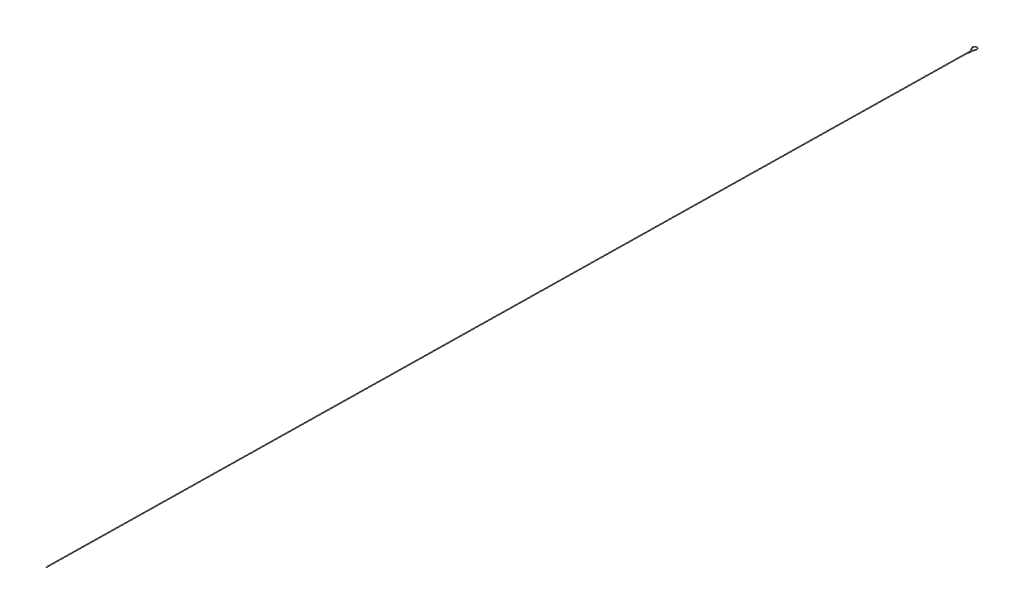
ISO-10303-21;
HEADER;
FILE_DESCRIPTION(('STEP AP214'),'2;1');
FILE_NAME('part.step','',(''),(''),'','','');
FILE_SCHEMA(('AUTOMOTIVE_DESIGN { 1 0 10303 214 1 1 1 1 }'));
ENDSEC;
DATA;
#1=APPLICATION_CONTEXT('core data for automotive mechanical design processes');
#2=APPLICATION_PROTOCOL_DEFINITION('international standard','automotive_design',2000,#1);
#3=PRODUCT_CONTEXT('',#1,'mechanical');
#4=PRODUCT('Part','Part','',(#3));
#5=PRODUCT_RELATED_PRODUCT_CATEGORY('part','',(#4));
#6=PRODUCT_DEFINITION_FORMATION('','',#4);
#7=PRODUCT_DEFINITION_CONTEXT('part definition',#1,'design');
#8=PRODUCT_DEFINITION('design','',#6,#7);
#9=PRODUCT_DEFINITION_SHAPE('','',#8);
#10=(LENGTH_UNIT() NAMED_UNIT(*) SI_UNIT(.MILLI.,.METRE.));
#11=(NAMED_UNIT(*) PLANE_ANGLE_UNIT() SI_UNIT($,.RADIAN.));
#12=(NAMED_UNIT(*) SI_UNIT($,.STERADIAN.) SOLID_ANGLE_UNIT());
#13=UNCERTAINTY_MEASURE_WITH_UNIT(LENGTH_MEASURE(1.E-05),#10,'distance_accuracy_value','');
#14=(GEOMETRIC_REPRESENTATION_CONTEXT(3) GLOBAL_UNCERTAINTY_ASSIGNED_CONTEXT((#13)) GLOBAL_UNIT_ASSIGNED_CONTEXT((#10,
#11,#12)) REPRESENTATION_CONTEXT('',''));
#15=CARTESIAN_POINT('',(0.,0.,0.));
#16=DIRECTION('',(0.,0.,1.));
#17=DIRECTION('',(1.,0.,0.));
#18=AXIS2_PLACEMENT_3D('',#15,#16,#17);
#19=CARTESIAN_POINT('',(3.19999999999998,0.,-4558.79739076363));
#20=DIRECTION('',(0.,0.,-1.));
#21=DIRECTION('',(-1.,0.,0.));
#22=AXIS2_PLACEMENT_3D('',#19,#20,#21);
#23=PLANE('',#22);
#24=CARTESIAN_POINT('',(3.19999999999998,0.,-4558.79739076363));
#25=DIRECTION('',(0.,0.,-1.));
#26=DIRECTION('',(-1.,0.,0.));
#27=AXIS2_PLACEMENT_3D('',#24,#25,#26);
#28=CIRCLE('',#27,1.57499999999999);
#29=CARTESIAN_POINT('',(1.62499999999999,0.,-4558.79739076363));
#30=VERTEX_POINT('',#29);
#31=EDGE_CURVE('E40',#30,#30,#28,.T.);
#32=ORIENTED_EDGE('',*,*,#31,.F.);
#33=EDGE_LOOP('',(#32));
#34=FACE_BOUND('',#33,.T.);
#35=ADVANCED_FACE('F37',(#34),#23,.F.);
#36=CARTESIAN_POINT('',(-76.2,0.,10.));
#37=DIRECTION('',(0.,0.,1.));
#38=DIRECTION('',(1.,0.,0.));
#39=AXIS2_PLACEMENT_3D('',#36,#37,#38);
#40=PLANE('',#39);
#41=CARTESIAN_POINT('',(-76.2,0.,10.));
#42=DIRECTION('',(0.,0.,1.));
#43=DIRECTION('',(1.,0.,0.));
#44=AXIS2_PLACEMENT_3D('',#41,#42,#43);
#45=CIRCLE('',#44,1.57499999999999);
#46=CARTESIAN_POINT('',(-74.625,0.,10.));
#47=VERTEX_POINT('',#46);
#48=EDGE_CURVE('E45',#47,#47,#45,.T.);
#49=ORIENTED_EDGE('',*,*,#48,.T.);
#50=EDGE_LOOP('',(#49));
#51=FACE_BOUND('',#50,.T.);
#52=ADVANCED_FACE('F100',(#51),#40,.T.);
#53=CARTESIAN_POINT('',(3.19999999999998,0.,-4571.14076089777));
#54=DIRECTION('',(0.,0.,1.));
#55=DIRECTION('',(1.,0.,0.));
#56=AXIS2_PLACEMENT_3D('',#53,#54,#55);
#57=CYLINDRICAL_SURFACE('',#56,1.57499999999999);
#58=CARTESIAN_POINT('',(3.2,0.,-4570.94076089777));
#59=DIRECTION('',(-0.0145206306415862,0.,0.999894570085152));
#60=DIRECTION('',(-0.999894570085152,0.,-0.0145206306415862));
#61=AXIS2_PLACEMENT_3D('',#58,#59,#60);
#62=ELLIPSE('',#61,1.57516606962458,1.57499999999999);
#63=CARTESIAN_POINT('',(1.625,0.,-4570.96363330246));
#64=VERTEX_POINT('',#63);
#65=EDGE_CURVE('E63',#64,#64,#62,.T.);
#66=ORIENTED_EDGE('',*,*,#65,.T.);
#67=EDGE_LOOP('',(#66));
#68=FACE_BOUND('',#67,.T.);
#69=ORIENTED_EDGE('',*,*,#31,.T.);
#70=EDGE_LOOP('',(#69));
#71=FACE_BOUND('',#70,.T.);
#72=ADVANCED_FACE('F97',(#68,#71),#57,.T.);
#73=CARTESIAN_POINT('',(0.,0.,-4558.59739076363));
#74=DIRECTION('',(0.,0.,-1.));
#75=DIRECTION('',(-1.,0.,0.));
#76=AXIS2_PLACEMENT_3D('',#73,#74,#75);
#77=CYLINDRICAL_SURFACE('',#76,1.57499999999999);
#78=CARTESIAN_POINT('',(0.,0.,-4558.79739076363));
#79=DIRECTION('',(0.00835659181222621,0.,-0.999965083077046));
#80=DIRECTION('',(0.999965083077046,0.,0.00835659181222621));
#81=AXIS2_PLACEMENT_3D('',#78,#79,#80);
#82=ELLIPSE('',#81,1.57505499607394,1.57499999999999);
#83=CARTESIAN_POINT('',(1.57499999999998,0.,-4558.78422867195));
#84=VERTEX_POINT('',#83);
#85=EDGE_CURVE('E51',#84,#84,#82,.T.);
#86=ORIENTED_EDGE('',*,*,#85,.T.);
#87=EDGE_LOOP('',(#86));
#88=FACE_BOUND('',#87,.T.);
#89=CARTESIAN_POINT('',(0.,0.,-4567.06055415462));
#90=DIRECTION('',(0.,0.,1.));
#91=DIRECTION('',(1.,0.,0.));
#92=AXIS2_PLACEMENT_3D('',#89,#90,#91);
#93=CIRCLE('',#92,1.57499999999999);
#94=CARTESIAN_POINT('',(1.57500000000015,0.,-4567.06055415462));
#95=VERTEX_POINT('',#94);
#96=EDGE_CURVE('E58',#95,#95,#93,.T.);
#97=ORIENTED_EDGE('',*,*,#96,.T.);
#98=EDGE_LOOP('',(#97));
#99=FACE_BOUND('',#98,.T.);
#100=ADVANCED_FACE('F118',(#88,#99),#77,.T.);
#101=CARTESIAN_POINT('',(-10.,0.,-4567.06055415463));
#102=DIRECTION('',(0.,1.,0.));
#103=DIRECTION('',(0.,0.,1.));
#104=AXIS2_PLACEMENT_3D('',#101,#102,#103);
#105=TOROIDAL_SURFACE('',#104,10.0000000000002,1.57499999999999);
#106=CARTESIAN_POINT('',(-1.24707591146752,0.,-4571.89649459061));
#107=DIRECTION('',(0.48359404359858,0.,0.875292408853164));
#108=DIRECTION('',(0.875292408853164,0.,-0.48359404359858));
#109=AXIS2_PLACEMENT_3D('',#106,#107,#108);
#110=CIRCLE('',#109,1.57499999999999);
#111=CARTESIAN_POINT('',(0.131509632476552,0.,-4572.65815520928));
#112=VERTEX_POINT('',#111);
#113=EDGE_CURVE('E62',#112,#112,#110,.T.);
#114=CARTESIAN_POINT('',(-10.,0.,-4567.06055415463));
#115=DIRECTION('',(0.,1.,0.));
#116=DIRECTION('',(0.,0.,1.));
#117=AXIS2_PLACEMENT_3D('',#114,#115,#116);
#118=CIRCLE('',#117,11.5750000000001);
#119=EDGE_CURVE('',#95,#112,#118,.T.);
#120=ORIENTED_EDGE('',*,*,#96,.F.);
#121=ORIENTED_EDGE('',*,*,#113,.T.);
#122=ORIENTED_EDGE('',*,*,#119,.T.);
#123=ORIENTED_EDGE('',*,*,#119,.F.);
#124=EDGE_LOOP('',(#120,#122,#121,#123));
#125=FACE_BOUND('',#124,.T.);
#126=ADVANCED_FACE('F121',(#125),#105,.T.);
#127=CARTESIAN_POINT('',(-1.24707591146744,0.,-4571.89649459061));
#128=DIRECTION('',(-0.483594043598575,0.,-0.875292408853167));
#129=DIRECTION('',(-0.875292408853167,0.,0.483594043598575));
#130=AXIS2_PLACEMENT_3D('',#127,#128,#129);
#131=CYLINDRICAL_SURFACE('',#130,1.57499999999999);
#132=CARTESIAN_POINT('',(-10.4743342177333,0.,-4588.59758770148));
#133=DIRECTION('',(0.48359404359857,0.,0.87529240885317));
#134=DIRECTION('',(0.87529240885317,0.,-0.48359404359857));
#135=AXIS2_PLACEMENT_3D('',#132,#133,#134);
#136=CIRCLE('',#135,1.57499999999999);
#137=CARTESIAN_POINT('',(-11.8529197616755,0.,-4587.83592708281));
#138=VERTEX_POINT('',#137);
#139=EDGE_CURVE('E67',#138,#138,#136,.T.);
#140=ORIENTED_EDGE('',*,*,#139,.T.);
#141=EDGE_LOOP('',(#140));
#142=FACE_BOUND('',#141,.T.);
#143=ORIENTED_EDGE('',*,*,#113,.F.);
#144=EDGE_LOOP('',(#143));
#145=FACE_BOUND('',#144,.T.);
#146=ADVANCED_FACE('F125',(#142,#145),#131,.T.);
#147=CARTESIAN_POINT('',(-1.72141012920182,0.,-4593.43352813747));
#148=DIRECTION('',(0.,-1.,0.));
#149=DIRECTION('',(0.,0.,-1.));
#150=AXIS2_PLACEMENT_3D('',#147,#148,#149);
#151=TOROIDAL_SURFACE('',#150,9.99999999999917,1.57499999999999);
#152=CARTESIAN_POINT('',(-4.94857235881253,0.,-4602.89848582061));
#153=DIRECTION('',(-0.946495768314801,0.,0.32271622296094));
#154=DIRECTION('',(0.32271622296094,0.,0.946495768314801));
#155=AXIS2_PLACEMENT_3D('',#152,#153,#154);
#156=CIRCLE('',#155,1.57499999999999);
#157=CARTESIAN_POINT('',(-5.45685040997601,0.,-4604.38921665571));
#158=VERTEX_POINT('',#157);
#159=EDGE_CURVE('E71',#158,#158,#156,.T.);
#160=CARTESIAN_POINT('',(-1.72141012920182,0.,-4593.43352813747));
#161=DIRECTION('',(0.,-1.,0.));
#162=DIRECTION('',(0.,0.,-1.));
#163=AXIS2_PLACEMENT_3D('',#160,#161,#162);
#164=CIRCLE('',#163,11.5749999999992);
#165=EDGE_CURVE('',#138,#158,#164,.T.);
#166=ORIENTED_EDGE('',*,*,#139,.F.);
#167=ORIENTED_EDGE('',*,*,#159,.T.);
#168=ORIENTED_EDGE('',*,*,#165,.T.);
#169=ORIENTED_EDGE('',*,*,#165,.F.);
#170=EDGE_LOOP('',(#166,#168,#167,#169));
#171=FACE_BOUND('',#170,.T.);
#172=ADVANCED_FACE('F129',(#171),#151,.T.);
#173=CARTESIAN_POINT('',(-0.850076327207373,0.,-4590.87798956302));
#174=DIRECTION('',(0.,-1.,0.));
#175=DIRECTION('',(0.,0.,-1.));
#176=AXIS2_PLACEMENT_3D('',#173,#174,#175);
#177=TOROIDAL_SURFACE('',#176,12.699999999999,1.57499999999999);
#178=CARTESIAN_POINT('',(-3.09082513844426,0.,-4603.3787513304));
#179=DIRECTION('',(-0.984311950187897,0.,0.176436914270508));
#180=DIRECTION('',(0.176436914270508,0.,0.984311950187897));
#181=AXIS2_PLACEMENT_3D('',#178,#179,#180);
#182=CIRCLE('',#181,1.57499999999999);
#183=CARTESIAN_POINT('',(-3.36871327842044,0.,-4604.92904265195));
#184=VERTEX_POINT('',#183);
#185=EDGE_CURVE('E75',#184,#184,#182,.T.);
#186=CARTESIAN_POINT('',(-0.850076327207373,0.,-4590.87798956302));
#187=DIRECTION('',(0.,-1.,0.));
#188=DIRECTION('',(0.,0.,-1.));
#189=AXIS2_PLACEMENT_3D('',#186,#187,#188);
#190=CIRCLE('',#189,14.274999999999);
#191=EDGE_CURVE('',#158,#184,#190,.T.);
#192=ORIENTED_EDGE('',*,*,#159,.F.);
#193=ORIENTED_EDGE('',*,*,#185,.T.);
#194=ORIENTED_EDGE('',*,*,#191,.T.);
#195=ORIENTED_EDGE('',*,*,#191,.F.);
#196=EDGE_LOOP('',(#192,#194,#193,#195));
#197=FACE_BOUND('',#196,.T.);
#198=ADVANCED_FACE('F133',(#197),#177,.T.);
#199=CARTESIAN_POINT('',(-1.32645599573782,0.,-4593.53563182852));
#200=DIRECTION('',(0.,-1.,0.));
#201=DIRECTION('',(0.,0.,-1.));
#202=AXIS2_PLACEMENT_3D('',#199,#200,#201);
#203=TOROIDAL_SURFACE('',#202,9.99999999999996,1.57499999999999);
#204=CARTESIAN_POINT('',(7.61781591426211,0.,-4589.06349587353));
#205=DIRECTION('',(0.447213595499918,0.,-0.894427190999936));
#206=DIRECTION('',(-0.894427190999936,0.,-0.447213595499918));
#207=AXIS2_PLACEMENT_3D('',#204,#205,#206);
#208=CIRCLE('',#207,1.57499999999999);
#209=CARTESIAN_POINT('',(9.02653874008699,0.,-4588.35913446061));
#210=VERTEX_POINT('',#209);
#211=EDGE_CURVE('E79',#210,#210,#208,.T.);
#212=CARTESIAN_POINT('',(-1.32645599573782,0.,-4593.53563182852));
#213=DIRECTION('',(0.,-1.,0.));
#214=DIRECTION('',(0.,0.,-1.));
#215=AXIS2_PLACEMENT_3D('',#212,#213,#214);
#216=CIRCLE('',#215,11.575);
#217=EDGE_CURVE('',#184,#210,#216,.T.);
#218=ORIENTED_EDGE('',*,*,#185,.F.);
#219=ORIENTED_EDGE('',*,*,#211,.T.);
#220=ORIENTED_EDGE('',*,*,#217,.T.);
#221=ORIENTED_EDGE('',*,*,#217,.F.);
#222=EDGE_LOOP('',(#218,#220,#219,#221));
#223=FACE_BOUND('',#222,.T.);
#224=ADVANCED_FACE('F137',(#223),#203,.T.);
#225=CARTESIAN_POINT('',(7.61781591426224,0.,-4589.06349587353));
#226=DIRECTION('',(-0.447213595499905,0.,0.894427190999943));
#227=DIRECTION('',(0.894427190999943,0.,0.447213595499905));
#228=AXIS2_PLACEMENT_3D('',#225,#226,#227);
#229=CYLINDRICAL_SURFACE('',#228,1.57499999999999);
#230=CARTESIAN_POINT('',(4.47383475229891,0.,-4582.7755335496));
#231=DIRECTION('',(0.44721359549991,0.,-0.89442719099994));
#232=DIRECTION('',(-0.89442719099994,0.,-0.44721359549991));
#233=AXIS2_PLACEMENT_3D('',#230,#231,#232);
#234=CIRCLE('',#233,1.57499999999999);
#235=CARTESIAN_POINT('',(3.06511192647372,0.,-4583.47989496251));
#236=VERTEX_POINT('',#235);
#237=EDGE_CURVE('E83',#236,#236,#234,.T.);
#238=ORIENTED_EDGE('',*,*,#237,.T.);
#239=EDGE_LOOP('',(#238));
#240=FACE_BOUND('',#239,.T.);
#241=ORIENTED_EDGE('',*,*,#211,.F.);
#242=EDGE_LOOP('',(#241));
#243=FACE_BOUND('',#242,.T.);
#244=ADVANCED_FACE('F141',(#240,#243),#229,.T.);
#245=CARTESIAN_POINT('',(13.4181066622976,0.,-4578.3033975946));
#246=DIRECTION('',(0.,1.,0.));
#247=DIRECTION('',(0.,0.,1.));
#248=AXIS2_PLACEMENT_3D('',#245,#246,#247);
#249=TOROIDAL_SURFACE('',#248,10.0000000000002,1.57499999999999);
#250=CARTESIAN_POINT('',(3.42232363658224,0.,-4578.59377958926));
#251=DIRECTION('',(0.029038199465431,0.,-0.999578302571542));
#252=DIRECTION('',(-0.999578302571542,0.,-0.029038199465431));
#253=AXIS2_PLACEMENT_3D('',#250,#251,#252);
#254=CIRCLE('',#253,1.57499999999999);
#255=CARTESIAN_POINT('',(1.84798781003191,0.,-4578.63951475341));
#256=VERTEX_POINT('',#255);
#257=EDGE_CURVE('E57',#256,#256,#254,.T.);
#258=CARTESIAN_POINT('',(13.4181066622976,0.,-4578.3033975946));
#259=DIRECTION('',(0.,1.,0.));
#260=DIRECTION('',(0.,0.,1.));
#261=AXIS2_PLACEMENT_3D('',#258,#259,#260);
#262=CIRCLE('',#261,11.5750000000002);
#263=EDGE_CURVE('',#236,#256,#262,.T.);
#264=ORIENTED_EDGE('',*,*,#237,.F.);
#265=ORIENTED_EDGE('',*,*,#257,.T.);
#266=ORIENTED_EDGE('',*,*,#263,.T.);
#267=ORIENTED_EDGE('',*,*,#263,.F.);
#268=EDGE_LOOP('',(#264,#266,#265,#267));
#269=FACE_BOUND('',#268,.T.);
#270=ADVANCED_FACE('F145',(#269),#249,.T.);
#271=CARTESIAN_POINT('',(3.42232363658221,0.,-4578.59377958925));
#272=DIRECTION('',(-0.0290381994654682,0.,0.999578302571541));
#273=DIRECTION('',(0.999578302571541,0.,0.0290381994654682));
#274=AXIS2_PLACEMENT_3D('',#271,#272,#273);
#275=CYLINDRICAL_SURFACE('',#274,1.57499999999999);
#276=ORIENTED_EDGE('',*,*,#257,.F.);
#277=EDGE_LOOP('',(#276));
#278=FACE_BOUND('',#277,.T.);
#279=ORIENTED_EDGE('',*,*,#65,.F.);
#280=EDGE_LOOP('',(#279));
#281=FACE_BOUND('',#280,.T.);
#282=ADVANCED_FACE('F113',(#278,#281),#275,.T.);
#283=CARTESIAN_POINT('',(-76.2033425200104,0.,0.199972066949314));
#284=DIRECTION('',(0.0167126000515075,0.,-0.999860334746568));
#285=DIRECTION('',(-0.999860334746568,0.,-0.0167126000515075));
#286=AXIS2_PLACEMENT_3D('',#283,#284,#285);
#287=CYLINDRICAL_SURFACE('',#286,1.57499999999999);
#288=CARTESIAN_POINT('',(-76.2,0.,0.));
#289=DIRECTION('',(0.00835659181222344,0.,-0.999965083077046));
#290=DIRECTION('',(-0.999965083077046,0.,-0.00835659181222344));
#291=AXIS2_PLACEMENT_3D('',#288,#289,#290);
#292=ELLIPSE('',#291,1.57505499607394,1.57499999999999);
#293=CARTESIAN_POINT('',(-77.775,0.,-0.0131620916839844));
#294=VERTEX_POINT('',#293);
#295=EDGE_CURVE('E10',#294,#294,#292,.T.);
#296=ORIENTED_EDGE('',*,*,#295,.T.);
#297=EDGE_LOOP('',(#296));
#298=FACE_BOUND('',#297,.T.);
#299=ORIENTED_EDGE('',*,*,#85,.F.);
#300=EDGE_LOOP('',(#299));
#301=FACE_BOUND('',#300,.T.);
#302=ADVANCED_FACE('F107',(#298,#301),#287,.T.);
#303=CARTESIAN_POINT('',(-76.2,0.,10.));
#304=DIRECTION('',(0.,0.,-1.));
#305=DIRECTION('',(-1.,0.,0.));
#306=AXIS2_PLACEMENT_3D('',#303,#304,#305);
#307=CYLINDRICAL_SURFACE('',#306,1.57499999999999);
#308=ORIENTED_EDGE('',*,*,#48,.F.);
#309=EDGE_LOOP('',(#308));
#310=FACE_BOUND('',#309,.T.);
#311=ORIENTED_EDGE('',*,*,#295,.F.);
#312=EDGE_LOOP('',(#311));
#313=FACE_BOUND('',#312,.T.);
#314=ADVANCED_FACE('F105',(#310,#313),#307,.T.);
#315=CLOSED_SHELL('',(#35,#52,#72,#100,#126,#146,#172,#198,#224,#244,#270,#282,#302,#314));
#316=MANIFOLD_SOLID_BREP('B2',#315);
#317=ADVANCED_BREP_SHAPE_REPRESENTATION('',(#18,#316),#14);
#318=SHAPE_DEFINITION_REPRESENTATION(#9,#317);
ENDSEC;
END-ISO-10303-21;
